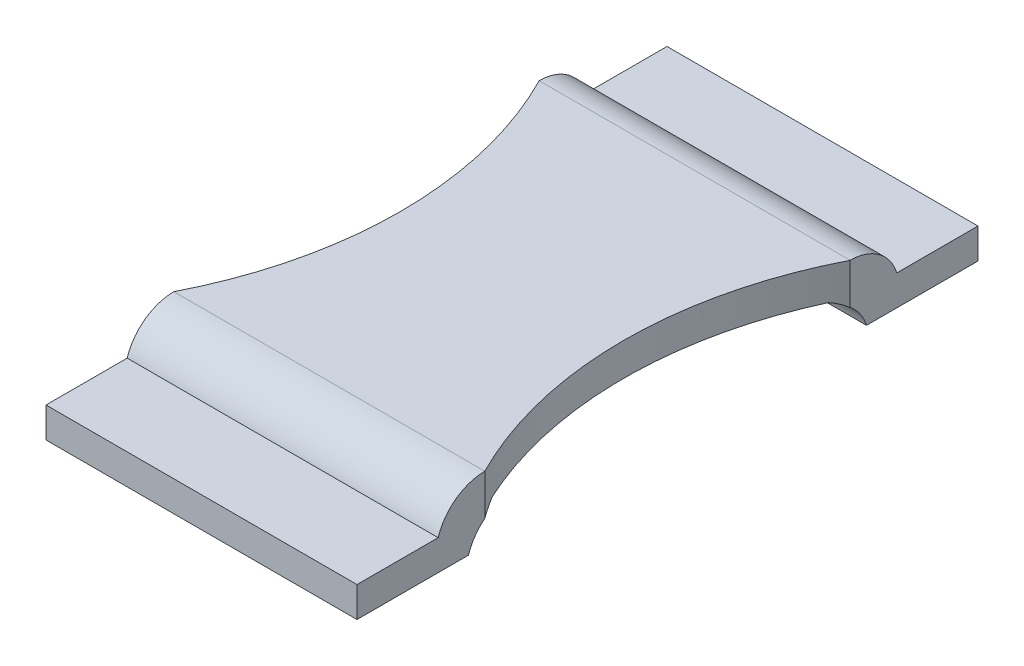
ISO-10303-21;
HEADER;
FILE_DESCRIPTION(('STEP AP214'),'2;1');
FILE_NAME('part.step','',(''),(''),'','','');
FILE_SCHEMA(('AUTOMOTIVE_DESIGN { 1 0 10303 214 1 1 1 1 }'));
ENDSEC;
DATA;
#1=APPLICATION_CONTEXT('core data for automotive mechanical design processes');
#2=APPLICATION_PROTOCOL_DEFINITION('international standard','automotive_design',2000,#1);
#3=PRODUCT_CONTEXT('',#1,'mechanical');
#4=PRODUCT('Part','Part','',(#3));
#5=PRODUCT_RELATED_PRODUCT_CATEGORY('part','',(#4));
#6=PRODUCT_DEFINITION_FORMATION('','',#4);
#7=PRODUCT_DEFINITION_CONTEXT('part definition',#1,'design');
#8=PRODUCT_DEFINITION('design','',#6,#7);
#9=PRODUCT_DEFINITION_SHAPE('','',#8);
#10=(LENGTH_UNIT() NAMED_UNIT(*) SI_UNIT(.MILLI.,.METRE.));
#11=(NAMED_UNIT(*) PLANE_ANGLE_UNIT() SI_UNIT($,.RADIAN.));
#12=(NAMED_UNIT(*) SI_UNIT($,.STERADIAN.) SOLID_ANGLE_UNIT());
#13=UNCERTAINTY_MEASURE_WITH_UNIT(LENGTH_MEASURE(1.E-05),#10,'distance_accuracy_value','');
#14=(GEOMETRIC_REPRESENTATION_CONTEXT(3) GLOBAL_UNCERTAINTY_ASSIGNED_CONTEXT((#13)) GLOBAL_UNIT_ASSIGNED_CONTEXT((#10,
#11,#12)) REPRESENTATION_CONTEXT('',''));
#15=CARTESIAN_POINT('',(0.,0.,0.));
#16=DIRECTION('',(0.,0.,1.));
#17=DIRECTION('',(1.,0.,0.));
#18=AXIS2_PLACEMENT_3D('',#15,#16,#17);
#19=CARTESIAN_POINT('',(1.59,0.66,-2.345));
#20=DIRECTION('',(0.,-1.,0.));
#21=DIRECTION('',(0.,0.,-1.));
#22=AXIS2_PLACEMENT_3D('',#19,#20,#21);
#23=PLANE('',#22);
#24=CARTESIAN_POINT('',(-5.25261765457511,0.66,0.));
#25=DIRECTION('',(0.,1.,0.));
#26=DIRECTION('',(0.,0.,1.));
#27=AXIS2_PLACEMENT_3D('',#24,#25,#26);
#28=CIRCLE('',#27,4.11148460489427);
#29=CARTESIAN_POINT('',(-1.59,0.66,1.86803039929153));
#30=VERTEX_POINT('',#29);
#31=CARTESIAN_POINT('',(-1.59,0.66,-1.86803039929153));
#32=VERTEX_POINT('',#31);
#33=EDGE_CURVE('E104',#30,#32,#28,.T.);
#34=ORIENTED_EDGE('',*,*,#33,.F.);
#35=DIRECTION('',(-1.,0.,0.));
#36=VECTOR('',#35,1.);
#37=CARTESIAN_POINT('',(1.59,0.66,1.86803039929153));
#38=LINE('',#37,#36);
#39=CARTESIAN_POINT('',(1.59,0.66,1.86803039929153));
#40=VERTEX_POINT('',#39);
#41=EDGE_CURVE('E238',#30,#40,#38,.F.);
#42=ORIENTED_EDGE('',*,*,#41,.T.);
#43=CARTESIAN_POINT('',(5.25261765457511,0.66,0.));
#44=DIRECTION('',(0.,1.,0.));
#45=DIRECTION('',(0.,0.,1.));
#46=AXIS2_PLACEMENT_3D('',#43,#44,#45);
#47=CIRCLE('',#46,4.11148460489427);
#48=CARTESIAN_POINT('',(1.59,0.66,-1.86803039929153));
#49=VERTEX_POINT('',#48);
#50=EDGE_CURVE('E40',#40,#49,#47,.F.);
#51=ORIENTED_EDGE('',*,*,#50,.T.);
#52=DIRECTION('',(1.,0.,0.));
#53=VECTOR('',#52,1.);
#54=CARTESIAN_POINT('',(1.59,0.66,-1.86803039929153));
#55=LINE('',#54,#53);
#56=EDGE_CURVE('E155',#49,#32,#55,.F.);
#57=ORIENTED_EDGE('',*,*,#56,.T.);
#58=EDGE_LOOP('',(#34,#42,#51,#57));
#59=FACE_BOUND('',#58,.T.);
#60=ADVANCED_FACE('F37',(#59),#23,.F.);
#61=CARTESIAN_POINT('',(-5.25261765457511,0.,0.));
#62=DIRECTION('',(0.,1.,0.));
#63=DIRECTION('',(0.,0.,1.));
#64=AXIS2_PLACEMENT_3D('',#61,#62,#63);
#65=CYLINDRICAL_SURFACE('',#64,4.11148460489427);
#66=CARTESIAN_POINT('',(-1.44777246309018,0.35,-1.55803039929153));
#67=CARTESIAN_POINT('',(-1.46050132622597,0.350009938777516,-1.58915575085656));
#68=CARTESIAN_POINT('',(-1.47363435534162,0.347095343889308,-1.62009898683069));
#69=CARTESIAN_POINT('',(-1.49990599731127,0.335820085328817,-1.68002162033468));
#70=CARTESIAN_POINT('',(-1.51303614940056,0.327598346262748,-1.70903084428568));
#71=CARTESIAN_POINT('',(-1.53691836314421,0.307949254157901,-1.76026838945884));
#72=CARTESIAN_POINT('',(-1.54768784319012,0.297325382088979,-1.7828000551749));
#73=CARTESIAN_POINT('',(-1.56909059498095,0.272499219786441,-1.82662209350082));
#74=CARTESIAN_POINT('',(-1.57971606888503,0.258225473530586,-1.84787576497226));
#75=CARTESIAN_POINT('',(-1.59,0.242300904918661,-1.86803039929153));
#76=B_SPLINE_CURVE_WITH_KNOTS('',3,(#66,#67,#68,#69,#70,#71,#72,#73,#74,#75),.UNSPECIFIED.,.F.,
.F.,(4,2,2,2,4),(0.,0.100737517097783,0.198939460536451,0.280106380117037,0.363003600459455),.UNSPECIFIED.);
#77=CARTESIAN_POINT('',(-1.51728939545346,0.323708771293081,-1.71803039929153));
#78=VERTEX_POINT('',#77);
#79=CARTESIAN_POINT('',(-1.59,0.242300904918661,-1.86803039929153));
#80=VERTEX_POINT('',#79);
#81=EDGE_CURVE('E125',#78,#80,#76,.T.);
#82=ORIENTED_EDGE('',*,*,#81,.F.);
#83=CARTESIAN_POINT('',(-5.25261765457511,0.32370877129308,0.));
#84=DIRECTION('',(0.,-1.,0.));
#85=DIRECTION('',(0.,0.,1.));
#86=AXIS2_PLACEMENT_3D('',#83,#84,#85);
#87=CIRCLE('',#86,4.11148460489427);
#88=CARTESIAN_POINT('',(-1.51728939545346,0.32370877129308,1.71803039929153));
#89=VERTEX_POINT('',#88);
#90=EDGE_CURVE('E246',#78,#89,#87,.T.);
#91=ORIENTED_EDGE('',*,*,#90,.T.);
#92=CARTESIAN_POINT('',(-1.59,0.24230090491866,1.86803039929153));
#93=CARTESIAN_POINT('',(-1.57753560573846,0.261598530116619,1.84361744643467));
#94=CARTESIAN_POINT('',(-1.56457232773567,0.278471925225271,1.81757283108944));
#95=CARTESIAN_POINT('',(-1.53851901399788,0.306729637112899,1.76369638021265));
#96=CARTESIAN_POINT('',(-1.52544031301243,0.318241016545582,1.73592575708514));
#97=CARTESIAN_POINT('',(-1.50153639874094,0.33462681911745,1.68356215696706));
#98=CARTESIAN_POINT('',(-1.49070111880703,0.340290557278802,1.65921736807923));
#99=CARTESIAN_POINT('',(-1.46907583133047,0.348017980606731,1.60931159680399));
#100=CARTESIAN_POINT('',(-1.45829174794817,0.350002082170178,1.58373573914565));
#101=CARTESIAN_POINT('',(-1.44777246309018,0.35,1.55803039929153));
#102=B_SPLINE_CURVE_WITH_KNOTS('',3,(#92,#93,#94,#95,#96,#97,#98,#99,#100,#101),.UNSPECIFIED.,
.F.,.F.,(4,2,2,2,4),(0.,0.100413307627722,0.19830803229291,0.279784566253145,0.363003610314782),.UNSPECIFIED.);
#103=CARTESIAN_POINT('',(-1.59,0.24230090491866,1.86803039929153));
#104=VERTEX_POINT('',#103);
#105=EDGE_CURVE('E202',#104,#89,#102,.T.);
#106=ORIENTED_EDGE('',*,*,#105,.F.);
#107=DIRECTION('',(0.,1.,0.));
#108=VECTOR('',#107,1.);
#109=CARTESIAN_POINT('',(-1.59,0.,1.86803039929153));
#110=LINE('',#109,#108);
#111=EDGE_CURVE('E187',#104,#30,#110,.T.);
#112=ORIENTED_EDGE('',*,*,#111,.T.);
#113=ORIENTED_EDGE('',*,*,#33,.T.);
#114=DIRECTION('',(0.,1.,0.));
#115=VECTOR('',#114,1.);
#116=CARTESIAN_POINT('',(-1.59,0.,-1.86803039929153));
#117=LINE('',#116,#115);
#118=EDGE_CURVE('E134',#80,#32,#117,.T.);
#119=ORIENTED_EDGE('',*,*,#118,.F.);
#120=EDGE_LOOP('',(#82,#91,#106,#112,#113,#119));
#121=FACE_BOUND('',#120,.T.);
#122=ADVANCED_FACE('F175',(#121),#65,.F.);
#123=CARTESIAN_POINT('',(5.25261765457511,0.,0.));
#124=DIRECTION('',(0.,1.,0.));
#125=DIRECTION('',(0.,0.,1.));
#126=AXIS2_PLACEMENT_3D('',#123,#124,#125);
#127=CYLINDRICAL_SURFACE('',#126,4.11148460489427);
#128=ORIENTED_EDGE('',*,*,#50,.F.);
#129=DIRECTION('',(0.,1.,0.));
#130=VECTOR('',#129,1.);
#131=CARTESIAN_POINT('',(1.59,0.,1.86803039929153));
#132=LINE('',#131,#130);
#133=CARTESIAN_POINT('',(1.59,0.24230090491866,1.86803039929153));
#134=VERTEX_POINT('',#133);
#135=EDGE_CURVE('E188',#134,#40,#132,.T.);
#136=ORIENTED_EDGE('',*,*,#135,.F.);
#137=CARTESIAN_POINT('',(1.59,0.24230090491866,1.86803039929153));
#138=CARTESIAN_POINT('',(1.57753560573845,0.261598530116619,1.84361744643467));
#139=CARTESIAN_POINT('',(1.56457232773567,0.278471925225271,1.81757283108944));
#140=CARTESIAN_POINT('',(1.53851901399788,0.306729637112899,1.76369638021265));
#141=CARTESIAN_POINT('',(1.52544031301243,0.318241016545582,1.73592575708514));
#142=CARTESIAN_POINT('',(1.50153639874094,0.33462681911745,1.68356215696706));
#143=CARTESIAN_POINT('',(1.49070111880703,0.340290557278801,1.65921736807923));
#144=CARTESIAN_POINT('',(1.46907583133046,0.34801798060673,1.60931159680399));
#145=CARTESIAN_POINT('',(1.45829174794817,0.350002082170178,1.58373573914565));
#146=CARTESIAN_POINT('',(1.44777246309018,0.35,1.55803039929153));
#147=B_SPLINE_CURVE_WITH_KNOTS('',3,(#137,#138,#139,#140,#141,#142,#143,#144,#145,#146),
.UNSPECIFIED.,.F.,.F.,(4,2,2,2,4),(0.,0.100413307627722,0.19830803229291,0.279784566253145,
0.363003610314783),.UNSPECIFIED.);
#148=CARTESIAN_POINT('',(1.51728939545347,0.32370877129308,1.71803039929153));
#149=VERTEX_POINT('',#148);
#150=EDGE_CURVE('E180',#134,#149,#147,.T.);
#151=ORIENTED_EDGE('',*,*,#150,.T.);
#152=CARTESIAN_POINT('',(5.25261765457511,0.32370877129308,0.));
#153=DIRECTION('',(0.,-1.,0.));
#154=DIRECTION('',(0.,0.,1.));
#155=AXIS2_PLACEMENT_3D('',#152,#153,#154);
#156=CIRCLE('',#155,4.11148460489427);
#157=CARTESIAN_POINT('',(1.51728939545347,0.32370877129308,-1.71803039929153));
#158=VERTEX_POINT('',#157);
#159=EDGE_CURVE('E102',#149,#158,#156,.T.);
#160=ORIENTED_EDGE('',*,*,#159,.T.);
#161=CARTESIAN_POINT('',(1.44777246309018,0.35,-1.55803039929153));
#162=CARTESIAN_POINT('',(1.46050132622597,0.350009938777516,-1.58915575085656));
#163=CARTESIAN_POINT('',(1.47363435534162,0.347095343889308,-1.62009898683069));
#164=CARTESIAN_POINT('',(1.49990599731127,0.335820085328817,-1.68002162033468));
#165=CARTESIAN_POINT('',(1.51303614940056,0.327598346262748,-1.70903084428568));
#166=CARTESIAN_POINT('',(1.53691836314421,0.307949254157901,-1.76026838945884));
#167=CARTESIAN_POINT('',(1.54768784319012,0.297325382088979,-1.7828000551749));
#168=CARTESIAN_POINT('',(1.56909059498095,0.272499219786442,-1.82662209350082));
#169=CARTESIAN_POINT('',(1.57971606888503,0.258225473530586,-1.84787576497226));
#170=CARTESIAN_POINT('',(1.59,0.242300904918661,-1.86803039929153));
#171=B_SPLINE_CURVE_WITH_KNOTS('',3,(#161,#162,#163,#164,#165,#166,#167,#168,#169,#170),
.UNSPECIFIED.,.F.,.F.,(4,2,2,2,4),(0.,0.100737517097783,0.198939460536451,0.280106380117036,
0.363003600459454),.UNSPECIFIED.);
#172=CARTESIAN_POINT('',(1.59,0.242300904918661,-1.86803039929153));
#173=VERTEX_POINT('',#172);
#174=EDGE_CURVE('E54',#158,#173,#171,.T.);
#175=ORIENTED_EDGE('',*,*,#174,.T.);
#176=DIRECTION('',(0.,1.,0.));
#177=VECTOR('',#176,1.);
#178=CARTESIAN_POINT('',(1.59,0.,-1.86803039929153));
#179=LINE('',#178,#177);
#180=EDGE_CURVE('E98',#173,#49,#179,.T.);
#181=ORIENTED_EDGE('',*,*,#180,.T.);
#182=EDGE_LOOP('',(#128,#136,#151,#160,#175,#181));
#183=FACE_BOUND('',#182,.T.);
#184=ADVANCED_FACE('F97',(#183),#127,.F.);
#185=CARTESIAN_POINT('',(1.59,0.,0.));
#186=DIRECTION('',(1.,0.,0.));
#187=DIRECTION('',(0.,0.,-1.));
#188=AXIS2_PLACEMENT_3D('',#185,#186,#187);
#189=PLANE('',#188);
#190=CARTESIAN_POINT('',(1.59,0.16,-1.86803039929153));
#191=DIRECTION('',(1.,0.,0.));
#192=DIRECTION('',(0.,0.,-1.));
#193=AXIS2_PLACEMENT_3D('',#190,#191,#192);
#194=CIRCLE('',#193,0.5);
#195=CARTESIAN_POINT('',(1.59,0.31,-2.345));
#196=VERTEX_POINT('',#195);
#197=EDGE_CURVE('E111',#196,#49,#194,.T.);
#198=ORIENTED_EDGE('',*,*,#197,.T.);
#199=ORIENTED_EDGE('',*,*,#180,.F.);
#200=CARTESIAN_POINT('',(1.59,-0.15,-1.55803039929153));
#201=DIRECTION('',(1.,0.,0.));
#202=DIRECTION('',(0.,0.,-1.));
#203=AXIS2_PLACEMENT_3D('',#200,#201,#202);
#204=CIRCLE('',#203,0.5);
#205=CARTESIAN_POINT('',(1.59,0.,-2.035));
#206=VERTEX_POINT('',#205);
#207=EDGE_CURVE('E108',#173,#206,#204,.F.);
#208=ORIENTED_EDGE('',*,*,#207,.T.);
#209=DIRECTION('',(0.,0.,-1.));
#210=VECTOR('',#209,1.);
#211=CARTESIAN_POINT('',(1.59,0.,-3.175));
#212=LINE('',#211,#210);
#213=CARTESIAN_POINT('',(1.59,0.,-3.175));
#214=VERTEX_POINT('',#213);
#215=EDGE_CURVE('E118',#206,#214,#212,.T.);
#216=ORIENTED_EDGE('',*,*,#215,.T.);
#217=DIRECTION('',(0.,1.,0.));
#218=VECTOR('',#217,1.);
#219=CARTESIAN_POINT('',(1.59,0.,-3.175));
#220=LINE('',#219,#218);
#221=CARTESIAN_POINT('',(1.59,0.31,-3.175));
#222=VERTEX_POINT('',#221);
#223=EDGE_CURVE('E120',#214,#222,#220,.T.);
#224=ORIENTED_EDGE('',*,*,#223,.T.);
#225=DIRECTION('',(0.,0.,1.));
#226=VECTOR('',#225,1.);
#227=CARTESIAN_POINT('',(1.59,0.31,-3.175));
#228=LINE('',#227,#226);
#229=EDGE_CURVE('E149',#222,#196,#228,.T.);
#230=ORIENTED_EDGE('',*,*,#229,.T.);
#231=EDGE_LOOP('',(#198,#199,#208,#216,#224,#230));
#232=FACE_BOUND('',#231,.T.);
#233=ADVANCED_FACE('F107',(#232),#189,.T.);
#234=CARTESIAN_POINT('',(1.59,-0.15,-1.55803039929153));
#235=DIRECTION('',(1.,0.,0.));
#236=DIRECTION('',(0.,0.,-1.));
#237=AXIS2_PLACEMENT_3D('',#234,#235,#236);
#238=CYLINDRICAL_SURFACE('',#237,0.5);
#239=ORIENTED_EDGE('',*,*,#174,.F.);
#240=DIRECTION('',(1.,0.,0.));
#241=VECTOR('',#240,1.);
#242=CARTESIAN_POINT('',(1.59,0.32370877129308,-1.71803039929153));
#243=LINE('',#242,#241);
#244=EDGE_CURVE('E151',#158,#78,#243,.F.);
#245=ORIENTED_EDGE('',*,*,#244,.T.);
#246=ORIENTED_EDGE('',*,*,#81,.T.);
#247=CARTESIAN_POINT('',(-1.59,-0.15,-1.55803039929153));
#248=DIRECTION('',(1.,0.,0.));
#249=DIRECTION('',(0.,0.,-1.));
#250=AXIS2_PLACEMENT_3D('',#247,#248,#249);
#251=CIRCLE('',#250,0.5);
#252=CARTESIAN_POINT('',(-1.59,0.,-2.035));
#253=VERTEX_POINT('',#252);
#254=EDGE_CURVE('E131',#253,#80,#251,.T.);
#255=ORIENTED_EDGE('',*,*,#254,.F.);
#256=DIRECTION('',(-1.,0.,0.));
#257=VECTOR('',#256,1.);
#258=CARTESIAN_POINT('',(1.59,0.,-2.035));
#259=LINE('',#258,#257);
#260=EDGE_CURVE('E117',#206,#253,#259,.T.);
#261=ORIENTED_EDGE('',*,*,#260,.F.);
#262=ORIENTED_EDGE('',*,*,#207,.F.);
#263=EDGE_LOOP('',(#239,#245,#246,#255,#261,#262));
#264=FACE_BOUND('',#263,.T.);
#265=ADVANCED_FACE('F115',(#264),#238,.F.);
#266=CARTESIAN_POINT('',(-1.59,0.,0.));
#267=DIRECTION('',(1.,0.,0.));
#268=DIRECTION('',(0.,0.,-1.));
#269=AXIS2_PLACEMENT_3D('',#266,#267,#268);
#270=PLANE('',#269);
#271=ORIENTED_EDGE('',*,*,#254,.T.);
#272=ORIENTED_EDGE('',*,*,#118,.T.);
#273=CARTESIAN_POINT('',(-1.59,0.16,-1.86803039929153));
#274=DIRECTION('',(1.,0.,0.));
#275=DIRECTION('',(0.,0.,-1.));
#276=AXIS2_PLACEMENT_3D('',#273,#274,#275);
#277=CIRCLE('',#276,0.5);
#278=CARTESIAN_POINT('',(-1.59,0.31,-2.345));
#279=VERTEX_POINT('',#278);
#280=EDGE_CURVE('E148',#32,#279,#277,.F.);
#281=ORIENTED_EDGE('',*,*,#280,.T.);
#282=DIRECTION('',(0.,0.,1.));
#283=VECTOR('',#282,1.);
#284=CARTESIAN_POINT('',(-1.59,0.31,-3.175));
#285=LINE('',#284,#283);
#286=CARTESIAN_POINT('',(-1.59,0.31,-3.175));
#287=VERTEX_POINT('',#286);
#288=EDGE_CURVE('E141',#287,#279,#285,.T.);
#289=ORIENTED_EDGE('',*,*,#288,.F.);
#290=DIRECTION('',(0.,1.,0.));
#291=VECTOR('',#290,1.);
#292=CARTESIAN_POINT('',(-1.59,0.,-3.175));
#293=LINE('',#292,#291);
#294=CARTESIAN_POINT('',(-1.59,0.,-3.175));
#295=VERTEX_POINT('',#294);
#296=EDGE_CURVE('E136',#295,#287,#293,.T.);
#297=ORIENTED_EDGE('',*,*,#296,.F.);
#298=DIRECTION('',(0.,0.,-1.));
#299=VECTOR('',#298,1.);
#300=CARTESIAN_POINT('',(-1.59,0.,-3.175));
#301=LINE('',#300,#299);
#302=EDGE_CURVE('E137',#253,#295,#301,.T.);
#303=ORIENTED_EDGE('',*,*,#302,.F.);
#304=EDGE_LOOP('',(#271,#272,#281,#289,#297,#303));
#305=FACE_BOUND('',#304,.T.);
#306=ADVANCED_FACE('F348',(#305),#270,.F.);
#307=CARTESIAN_POINT('',(1.59,0.,-3.175));
#308=DIRECTION('',(0.,1.,0.));
#309=DIRECTION('',(0.,0.,1.));
#310=AXIS2_PLACEMENT_3D('',#307,#308,#309);
#311=PLANE('',#310);
#312=ORIENTED_EDGE('',*,*,#302,.T.);
#313=DIRECTION('',(-1.,0.,0.));
#314=VECTOR('',#313,1.);
#315=CARTESIAN_POINT('',(1.59,0.,-3.175));
#316=LINE('',#315,#314);
#317=EDGE_CURVE('E138',#214,#295,#316,.T.);
#318=ORIENTED_EDGE('',*,*,#317,.F.);
#319=ORIENTED_EDGE('',*,*,#215,.F.);
#320=ORIENTED_EDGE('',*,*,#260,.T.);
#321=EDGE_LOOP('',(#312,#318,#319,#320));
#322=FACE_BOUND('',#321,.T.);
#323=ADVANCED_FACE('F391',(#322),#311,.F.);
#324=CARTESIAN_POINT('',(1.59,0.,-3.175));
#325=DIRECTION('',(0.,0.,1.));
#326=DIRECTION('',(0.,-1.,0.));
#327=AXIS2_PLACEMENT_3D('',#324,#325,#326);
#328=PLANE('',#327);
#329=ORIENTED_EDGE('',*,*,#296,.T.);
#330=DIRECTION('',(-1.,0.,0.));
#331=VECTOR('',#330,1.);
#332=CARTESIAN_POINT('',(1.59,0.31,-3.175));
#333=LINE('',#332,#331);
#334=EDGE_CURVE('E46',#222,#287,#333,.T.);
#335=ORIENTED_EDGE('',*,*,#334,.F.);
#336=ORIENTED_EDGE('',*,*,#223,.F.);
#337=ORIENTED_EDGE('',*,*,#317,.T.);
#338=EDGE_LOOP('',(#329,#335,#336,#337));
#339=FACE_BOUND('',#338,.T.);
#340=ADVANCED_FACE('F383',(#339),#328,.F.);
#341=CARTESIAN_POINT('',(1.59,0.31,-3.175));
#342=DIRECTION('',(0.,-1.,0.));
#343=DIRECTION('',(0.,0.,-1.));
#344=AXIS2_PLACEMENT_3D('',#341,#342,#343);
#345=PLANE('',#344);
#346=ORIENTED_EDGE('',*,*,#288,.T.);
#347=DIRECTION('',(-1.,0.,0.));
#348=VECTOR('',#347,1.);
#349=CARTESIAN_POINT('',(1.59,0.31,-2.345));
#350=LINE('',#349,#348);
#351=EDGE_CURVE('E11',#196,#279,#350,.T.);
#352=ORIENTED_EDGE('',*,*,#351,.F.);
#353=ORIENTED_EDGE('',*,*,#229,.F.);
#354=ORIENTED_EDGE('',*,*,#334,.T.);
#355=EDGE_LOOP('',(#346,#352,#353,#354));
#356=FACE_BOUND('',#355,.T.);
#357=ADVANCED_FACE('F375',(#356),#345,.F.);
#358=CARTESIAN_POINT('',(1.59,0.16,-1.86803039929153));
#359=DIRECTION('',(1.,0.,0.));
#360=DIRECTION('',(0.,0.,-1.));
#361=AXIS2_PLACEMENT_3D('',#358,#359,#360);
#362=CYLINDRICAL_SURFACE('',#361,0.5);
#363=ORIENTED_EDGE('',*,*,#197,.F.);
#364=ORIENTED_EDGE('',*,*,#351,.T.);
#365=ORIENTED_EDGE('',*,*,#280,.F.);
#366=ORIENTED_EDGE('',*,*,#56,.F.);
#367=EDGE_LOOP('',(#363,#364,#365,#366));
#368=FACE_BOUND('',#367,.T.);
#369=ADVANCED_FACE('F322',(#368),#362,.T.);
#370=CARTESIAN_POINT('',(-5.25261765457511,0.32370877129308,0.));
#371=DIRECTION('',(0.,1.,0.));
#372=DIRECTION('',(0.,0.,1.));
#373=AXIS2_PLACEMENT_3D('',#370,#371,#372);
#374=PLANE('',#373);
#375=ORIENTED_EDGE('',*,*,#90,.F.);
#376=ORIENTED_EDGE('',*,*,#244,.F.);
#377=ORIENTED_EDGE('',*,*,#159,.F.);
#378=DIRECTION('',(1.,0.,0.));
#379=VECTOR('',#378,1.);
#380=CARTESIAN_POINT('',(-1.51728939545346,0.32370877129308,1.71803039929153));
#381=LINE('',#380,#379);
#382=EDGE_CURVE('E255',#89,#149,#381,.T.);
#383=ORIENTED_EDGE('',*,*,#382,.F.);
#384=EDGE_LOOP('',(#375,#376,#377,#383));
#385=FACE_BOUND('',#384,.T.);
#386=ADVANCED_FACE('F316',(#385),#374,.F.);
#387=CARTESIAN_POINT('',(1.59,0.,3.175));
#388=DIRECTION('',(0.,0.,-1.));
#389=DIRECTION('',(0.,1.,0.));
#390=AXIS2_PLACEMENT_3D('',#387,#388,#389);
#391=PLANE('',#390);
#392=DIRECTION('',(0.,-1.,0.));
#393=VECTOR('',#392,1.);
#394=CARTESIAN_POINT('',(-1.59,0.,3.175));
#395=LINE('',#394,#393);
#396=CARTESIAN_POINT('',(-1.59,0.31,3.175));
#397=VERTEX_POINT('',#396);
#398=CARTESIAN_POINT('',(-1.59,0.,3.175));
#399=VERTEX_POINT('',#398);
#400=EDGE_CURVE('E222',#397,#399,#395,.T.);
#401=ORIENTED_EDGE('',*,*,#400,.T.);
#402=DIRECTION('',(-1.,0.,0.));
#403=VECTOR('',#402,1.);
#404=CARTESIAN_POINT('',(1.59,0.,3.175));
#405=LINE('',#404,#403);
#406=CARTESIAN_POINT('',(1.59,0.,3.175));
#407=VERTEX_POINT('',#406);
#408=EDGE_CURVE('E229',#407,#399,#405,.T.);
#409=ORIENTED_EDGE('',*,*,#408,.F.);
#410=DIRECTION('',(0.,-1.,0.));
#411=VECTOR('',#410,1.);
#412=CARTESIAN_POINT('',(1.59,0.,3.175));
#413=LINE('',#412,#411);
#414=CARTESIAN_POINT('',(1.59,0.31,3.175));
#415=VERTEX_POINT('',#414);
#416=EDGE_CURVE('E212',#415,#407,#413,.T.);
#417=ORIENTED_EDGE('',*,*,#416,.F.);
#418=DIRECTION('',(-1.,0.,0.));
#419=VECTOR('',#418,1.);
#420=CARTESIAN_POINT('',(1.59,0.31,3.175));
#421=LINE('',#420,#419);
#422=EDGE_CURVE('E232',#415,#397,#421,.T.);
#423=ORIENTED_EDGE('',*,*,#422,.T.);
#424=EDGE_LOOP('',(#401,#409,#417,#423));
#425=FACE_BOUND('',#424,.T.);
#426=ADVANCED_FACE('F314',(#425),#391,.F.);
#427=CARTESIAN_POINT('',(1.59,0.31,3.175));
#428=DIRECTION('',(0.,-1.,0.));
#429=DIRECTION('',(0.,0.,-1.));
#430=AXIS2_PLACEMENT_3D('',#427,#428,#429);
#431=PLANE('',#430);
#432=DIRECTION('',(0.,0.,1.));
#433=VECTOR('',#432,1.);
#434=CARTESIAN_POINT('',(-1.59,0.31,3.175));
#435=LINE('',#434,#433);
#436=CARTESIAN_POINT('',(-1.59,0.31,2.345));
#437=VERTEX_POINT('',#436);
#438=EDGE_CURVE('E208',#437,#397,#435,.T.);
#439=ORIENTED_EDGE('',*,*,#438,.T.);
#440=ORIENTED_EDGE('',*,*,#422,.F.);
#441=DIRECTION('',(0.,0.,1.));
#442=VECTOR('',#441,1.);
#443=CARTESIAN_POINT('',(1.59,0.31,3.175));
#444=LINE('',#443,#442);
#445=CARTESIAN_POINT('',(1.59,0.31,2.345));
#446=VERTEX_POINT('',#445);
#447=EDGE_CURVE('E209',#446,#415,#444,.T.);
#448=ORIENTED_EDGE('',*,*,#447,.F.);
#449=DIRECTION('',(-1.,0.,0.));
#450=VECTOR('',#449,1.);
#451=CARTESIAN_POINT('',(1.59,0.31,2.345));
#452=LINE('',#451,#450);
#453=EDGE_CURVE('E235',#446,#437,#452,.T.);
#454=ORIENTED_EDGE('',*,*,#453,.T.);
#455=EDGE_LOOP('',(#439,#440,#448,#454));
#456=FACE_BOUND('',#455,.T.);
#457=ADVANCED_FACE('F197',(#456),#431,.F.);
#458=CARTESIAN_POINT('',(1.59,0.16,1.86803039929153));
#459=DIRECTION('',(-1.,0.,0.));
#460=DIRECTION('',(0.,0.,1.));
#461=AXIS2_PLACEMENT_3D('',#458,#459,#460);
#462=CYLINDRICAL_SURFACE('',#461,0.5);
#463=CARTESIAN_POINT('',(1.59,0.16,1.86803039929153));
#464=DIRECTION('',(1.,0.,0.));
#465=DIRECTION('',(0.,0.,-1.));
#466=AXIS2_PLACEMENT_3D('',#463,#464,#465);
#467=CIRCLE('',#466,0.5);
#468=EDGE_CURVE('E243',#40,#446,#467,.T.);
#469=ORIENTED_EDGE('',*,*,#468,.F.);
#470=ORIENTED_EDGE('',*,*,#41,.F.);
#471=CARTESIAN_POINT('',(-1.59,0.16,1.86803039929153));
#472=DIRECTION('',(1.,0.,0.));
#473=DIRECTION('',(0.,0.,-1.));
#474=AXIS2_PLACEMENT_3D('',#471,#472,#473);
#475=CIRCLE('',#474,0.5);
#476=EDGE_CURVE('E247',#437,#30,#475,.F.);
#477=ORIENTED_EDGE('',*,*,#476,.F.);
#478=ORIENTED_EDGE('',*,*,#453,.F.);
#479=EDGE_LOOP('',(#469,#470,#477,#478));
#480=FACE_BOUND('',#479,.T.);
#481=ADVANCED_FACE('F199',(#480),#462,.T.);
#482=CARTESIAN_POINT('',(1.59,0.,3.175));
#483=DIRECTION('',(0.,1.,0.));
#484=DIRECTION('',(0.,0.,1.));
#485=AXIS2_PLACEMENT_3D('',#482,#483,#484);
#486=PLANE('',#485);
#487=DIRECTION('',(0.,0.,-1.));
#488=VECTOR('',#487,1.);
#489=CARTESIAN_POINT('',(-1.59,0.,3.175));
#490=LINE('',#489,#488);
#491=CARTESIAN_POINT('',(-1.59,0.,2.035));
#492=VERTEX_POINT('',#491);
#493=EDGE_CURVE('E213',#399,#492,#490,.T.);
#494=ORIENTED_EDGE('',*,*,#493,.T.);
#495=DIRECTION('',(-1.,0.,0.));
#496=VECTOR('',#495,1.);
#497=CARTESIAN_POINT('',(1.59,0.,2.035));
#498=LINE('',#497,#496);
#499=CARTESIAN_POINT('',(1.59,0.,2.035));
#500=VERTEX_POINT('',#499);
#501=EDGE_CURVE('E219',#500,#492,#498,.T.);
#502=ORIENTED_EDGE('',*,*,#501,.F.);
#503=DIRECTION('',(0.,0.,-1.));
#504=VECTOR('',#503,1.);
#505=CARTESIAN_POINT('',(1.59,0.,3.175));
#506=LINE('',#505,#504);
#507=EDGE_CURVE('E216',#407,#500,#506,.T.);
#508=ORIENTED_EDGE('',*,*,#507,.F.);
#509=ORIENTED_EDGE('',*,*,#408,.T.);
#510=EDGE_LOOP('',(#494,#502,#508,#509));
#511=FACE_BOUND('',#510,.T.);
#512=ADVANCED_FACE('F311',(#511),#486,.F.);
#513=CARTESIAN_POINT('',(-1.59,0.,0.));
#514=DIRECTION('',(1.,0.,0.));
#515=DIRECTION('',(0.,0.,-1.));
#516=AXIS2_PLACEMENT_3D('',#513,#514,#515);
#517=PLANE('',#516);
#518=ORIENTED_EDGE('',*,*,#476,.T.);
#519=ORIENTED_EDGE('',*,*,#111,.F.);
#520=CARTESIAN_POINT('',(-1.59,-0.15,1.55803039929153));
#521=DIRECTION('',(1.,0.,0.));
#522=DIRECTION('',(0.,0.,-1.));
#523=AXIS2_PLACEMENT_3D('',#520,#521,#522);
#524=CIRCLE('',#523,0.5);
#525=EDGE_CURVE('E239',#104,#492,#524,.T.);
#526=ORIENTED_EDGE('',*,*,#525,.T.);
#527=ORIENTED_EDGE('',*,*,#493,.F.);
#528=ORIENTED_EDGE('',*,*,#400,.F.);
#529=ORIENTED_EDGE('',*,*,#438,.F.);
#530=EDGE_LOOP('',(#518,#519,#526,#527,#528,#529));
#531=FACE_BOUND('',#530,.T.);
#532=ADVANCED_FACE('F308',(#531),#517,.F.);
#533=CARTESIAN_POINT('',(1.59,0.,0.));
#534=DIRECTION('',(1.,0.,0.));
#535=DIRECTION('',(0.,0.,-1.));
#536=AXIS2_PLACEMENT_3D('',#533,#534,#535);
#537=PLANE('',#536);
#538=CARTESIAN_POINT('',(1.59,-0.15,1.55803039929153));
#539=DIRECTION('',(1.,0.,0.));
#540=DIRECTION('',(0.,0.,-1.));
#541=AXIS2_PLACEMENT_3D('',#538,#539,#540);
#542=CIRCLE('',#541,0.5);
#543=EDGE_CURVE('E242',#500,#134,#542,.F.);
#544=ORIENTED_EDGE('',*,*,#543,.T.);
#545=ORIENTED_EDGE('',*,*,#135,.T.);
#546=ORIENTED_EDGE('',*,*,#468,.T.);
#547=ORIENTED_EDGE('',*,*,#447,.T.);
#548=ORIENTED_EDGE('',*,*,#416,.T.);
#549=ORIENTED_EDGE('',*,*,#507,.T.);
#550=EDGE_LOOP('',(#544,#545,#546,#547,#548,#549));
#551=FACE_BOUND('',#550,.T.);
#552=ADVANCED_FACE('F195',(#551),#537,.T.);
#553=CARTESIAN_POINT('',(1.59,-0.15,1.55803039929153));
#554=DIRECTION('',(-1.,0.,0.));
#555=DIRECTION('',(0.,0.,1.));
#556=AXIS2_PLACEMENT_3D('',#553,#554,#555);
#557=CYLINDRICAL_SURFACE('',#556,0.5);
#558=ORIENTED_EDGE('',*,*,#105,.T.);
#559=ORIENTED_EDGE('',*,*,#382,.T.);
#560=ORIENTED_EDGE('',*,*,#150,.F.);
#561=ORIENTED_EDGE('',*,*,#543,.F.);
#562=ORIENTED_EDGE('',*,*,#501,.T.);
#563=ORIENTED_EDGE('',*,*,#525,.F.);
#564=EDGE_LOOP('',(#558,#559,#560,#561,#562,#563));
#565=FACE_BOUND('',#564,.T.);
#566=ADVANCED_FACE('F190',(#565),#557,.F.);
#567=CLOSED_SHELL('',(#60,#122,#184,#233,#265,#306,#323,#340,#357,#369,#386,#426,#457,#481,#512,
#532,#552,#566));
#568=MANIFOLD_SOLID_BREP('B2',#567);
#569=ADVANCED_BREP_SHAPE_REPRESENTATION('',(#18,#568),#14);
#570=SHAPE_DEFINITION_REPRESENTATION(#9,#569);
ENDSEC;
END-ISO-10303-21;
